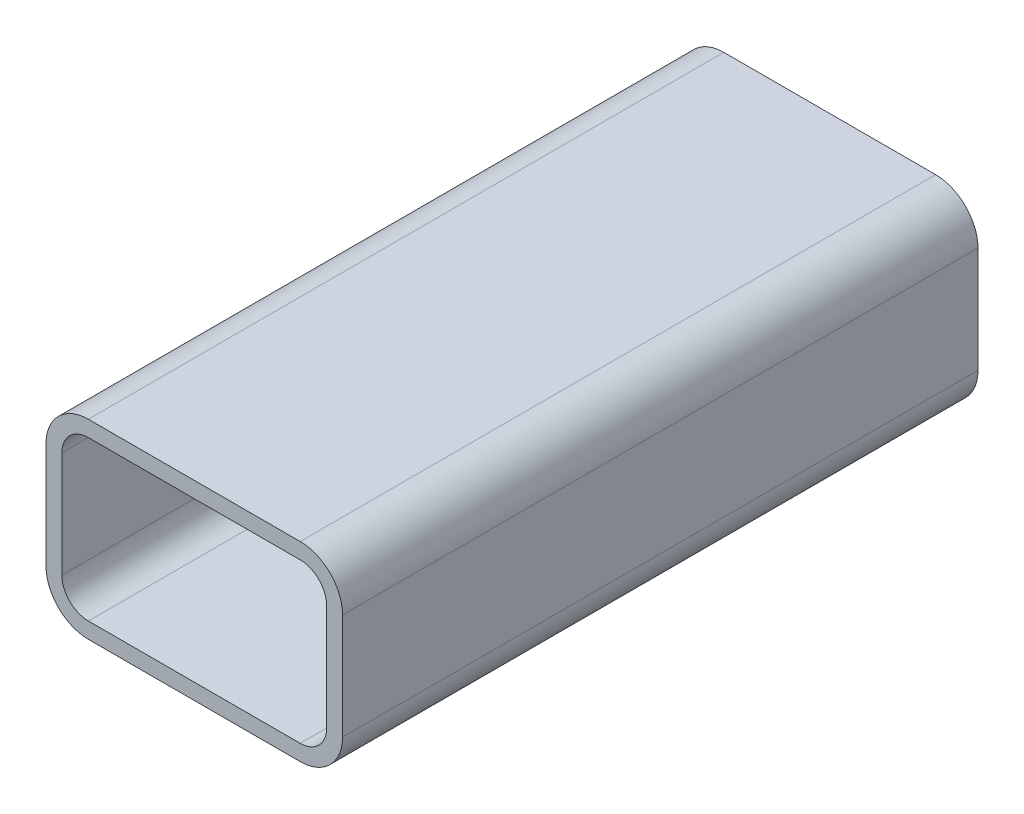
ISO-10303-21;
HEADER;
FILE_DESCRIPTION(('STEP AP214'),'2;1');
FILE_NAME('part.step','',(''),(''),'','','');
FILE_SCHEMA(('AUTOMOTIVE_DESIGN { 1 0 10303 214 1 1 1 1 }'));
ENDSEC;
DATA;
#1=APPLICATION_CONTEXT('core data for automotive mechanical design processes');
#2=APPLICATION_PROTOCOL_DEFINITION('international standard','automotive_design',2000,#1);
#3=PRODUCT_CONTEXT('',#1,'mechanical');
#4=PRODUCT('Part','Part','',(#3));
#5=PRODUCT_RELATED_PRODUCT_CATEGORY('part','',(#4));
#6=PRODUCT_DEFINITION_FORMATION('','',#4);
#7=PRODUCT_DEFINITION_CONTEXT('part definition',#1,'design');
#8=PRODUCT_DEFINITION('design','',#6,#7);
#9=PRODUCT_DEFINITION_SHAPE('','',#8);
#10=(LENGTH_UNIT() NAMED_UNIT(*) SI_UNIT(.MILLI.,.METRE.));
#11=(NAMED_UNIT(*) PLANE_ANGLE_UNIT() SI_UNIT($,.RADIAN.));
#12=(NAMED_UNIT(*) SI_UNIT($,.STERADIAN.) SOLID_ANGLE_UNIT());
#13=UNCERTAINTY_MEASURE_WITH_UNIT(LENGTH_MEASURE(1.E-05),#10,'distance_accuracy_value','');
#14=(GEOMETRIC_REPRESENTATION_CONTEXT(3) GLOBAL_UNCERTAINTY_ASSIGNED_CONTEXT((#13)) GLOBAL_UNIT_ASSIGNED_CONTEXT((#10,
#11,#12)) REPRESENTATION_CONTEXT('',''));
#15=CARTESIAN_POINT('',(0.,0.,0.));
#16=DIRECTION('',(0.,0.,1.));
#17=DIRECTION('',(1.,0.,0.));
#18=AXIS2_PLACEMENT_3D('',#15,#16,#17);
#19=CARTESIAN_POINT('',(-20.,10.,60.));
#20=DIRECTION('',(0.,0.,-1.));
#21=DIRECTION('',(-1.,0.,0.));
#22=AXIS2_PLACEMENT_3D('',#19,#20,#21);
#23=PLANE('',#22);
#24=CARTESIAN_POINT('',(-20.,10.,60.));
#25=DIRECTION('',(0.,0.,-1.));
#26=DIRECTION('',(-1.,0.,0.));
#27=AXIS2_PLACEMENT_3D('',#24,#25,#26);
#28=CIRCLE('',#27,8.);
#29=CARTESIAN_POINT('',(-20.,18.,60.));
#30=VERTEX_POINT('',#29);
#31=CARTESIAN_POINT('',(-28.,10.,60.));
#32=VERTEX_POINT('',#31);
#33=EDGE_CURVE('E290',#30,#32,#28,.F.);
#34=ORIENTED_EDGE('',*,*,#33,.T.);
#35=DIRECTION('',(0.,-1.,0.));
#36=VECTOR('',#35,1.);
#37=CARTESIAN_POINT('',(-28.,10.,60.));
#38=LINE('',#37,#36);
#39=CARTESIAN_POINT('',(-28.,-10.,60.));
#40=VERTEX_POINT('',#39);
#41=EDGE_CURVE('E294',#32,#40,#38,.T.);
#42=ORIENTED_EDGE('',*,*,#41,.T.);
#43=CARTESIAN_POINT('',(-20.,-10.,60.));
#44=DIRECTION('',(0.,0.,-1.));
#45=DIRECTION('',(-1.,0.,0.));
#46=AXIS2_PLACEMENT_3D('',#43,#44,#45);
#47=CIRCLE('',#46,8.);
#48=CARTESIAN_POINT('',(-20.,-18.,60.));
#49=VERTEX_POINT('',#48);
#50=EDGE_CURVE('E298',#40,#49,#47,.F.);
#51=ORIENTED_EDGE('',*,*,#50,.T.);
#52=DIRECTION('',(1.,0.,0.));
#53=VECTOR('',#52,1.);
#54=CARTESIAN_POINT('',(-20.,-18.,60.));
#55=LINE('',#54,#53);
#56=CARTESIAN_POINT('',(20.,-18.,60.));
#57=VERTEX_POINT('',#56);
#58=EDGE_CURVE('E301',#49,#57,#55,.T.);
#59=ORIENTED_EDGE('',*,*,#58,.T.);
#60=CARTESIAN_POINT('',(20.,-10.,60.));
#61=DIRECTION('',(0.,0.,-1.));
#62=DIRECTION('',(-1.,0.,0.));
#63=AXIS2_PLACEMENT_3D('',#60,#61,#62);
#64=CIRCLE('',#63,8.);
#65=CARTESIAN_POINT('',(28.,-10.,60.));
#66=VERTEX_POINT('',#65);
#67=EDGE_CURVE('E304',#57,#66,#64,.F.);
#68=ORIENTED_EDGE('',*,*,#67,.T.);
#69=DIRECTION('',(0.,1.,0.));
#70=VECTOR('',#69,1.);
#71=CARTESIAN_POINT('',(28.,10.,60.));
#72=LINE('',#71,#70);
#73=CARTESIAN_POINT('',(28.,10.,60.));
#74=VERTEX_POINT('',#73);
#75=EDGE_CURVE('E307',#66,#74,#72,.T.);
#76=ORIENTED_EDGE('',*,*,#75,.T.);
#77=CARTESIAN_POINT('',(20.,10.,60.));
#78=DIRECTION('',(0.,0.,-1.));
#79=DIRECTION('',(-1.,0.,0.));
#80=AXIS2_PLACEMENT_3D('',#77,#78,#79);
#81=CIRCLE('',#80,8.);
#82=CARTESIAN_POINT('',(20.,18.,60.));
#83=VERTEX_POINT('',#82);
#84=EDGE_CURVE('E310',#74,#83,#81,.F.);
#85=ORIENTED_EDGE('',*,*,#84,.T.);
#86=DIRECTION('',(-1.,0.,0.));
#87=VECTOR('',#86,1.);
#88=CARTESIAN_POINT('',(-20.,18.,60.));
#89=LINE('',#88,#87);
#90=EDGE_CURVE('E313',#83,#30,#89,.T.);
#91=ORIENTED_EDGE('',*,*,#90,.T.);
#92=EDGE_LOOP('',(#34,#42,#51,#59,#68,#76,#85,#91));
#93=FACE_BOUND('',#92,.T.);
#94=CARTESIAN_POINT('',(-20.,10.,60.));
#95=DIRECTION('',(0.,0.,1.));
#96=DIRECTION('',(-1.,0.,0.));
#97=AXIS2_PLACEMENT_3D('',#94,#95,#96);
#98=CIRCLE('',#97,5.);
#99=CARTESIAN_POINT('',(-20.,15.,60.));
#100=VERTEX_POINT('',#99);
#101=CARTESIAN_POINT('',(-25.,10.,60.));
#102=VERTEX_POINT('',#101);
#103=EDGE_CURVE('E201',#100,#102,#98,.T.);
#104=ORIENTED_EDGE('',*,*,#103,.F.);
#105=DIRECTION('',(-1.,0.,0.));
#106=VECTOR('',#105,1.);
#107=CARTESIAN_POINT('',(-20.,15.,60.));
#108=LINE('',#107,#106);
#109=CARTESIAN_POINT('',(20.,15.,60.));
#110=VERTEX_POINT('',#109);
#111=EDGE_CURVE('E242',#110,#100,#108,.T.);
#112=ORIENTED_EDGE('',*,*,#111,.F.);
#113=CARTESIAN_POINT('',(20.,10.,60.));
#114=DIRECTION('',(0.,0.,1.));
#115=DIRECTION('',(-1.,0.,0.));
#116=AXIS2_PLACEMENT_3D('',#113,#114,#115);
#117=CIRCLE('',#116,5.);
#118=CARTESIAN_POINT('',(25.,10.,60.));
#119=VERTEX_POINT('',#118);
#120=EDGE_CURVE('E239',#119,#110,#117,.T.);
#121=ORIENTED_EDGE('',*,*,#120,.F.);
#122=DIRECTION('',(0.,1.,0.));
#123=VECTOR('',#122,1.);
#124=CARTESIAN_POINT('',(25.,-10.,60.));
#125=LINE('',#124,#123);
#126=CARTESIAN_POINT('',(25.,-10.,60.));
#127=VERTEX_POINT('',#126);
#128=EDGE_CURVE('E236',#127,#119,#125,.T.);
#129=ORIENTED_EDGE('',*,*,#128,.F.);
#130=CARTESIAN_POINT('',(20.,-10.,60.));
#131=DIRECTION('',(0.,0.,1.));
#132=DIRECTION('',(-1.,0.,0.));
#133=AXIS2_PLACEMENT_3D('',#130,#131,#132);
#134=CIRCLE('',#133,5.);
#135=CARTESIAN_POINT('',(20.,-15.,60.));
#136=VERTEX_POINT('',#135);
#137=EDGE_CURVE('E233',#136,#127,#134,.T.);
#138=ORIENTED_EDGE('',*,*,#137,.F.);
#139=DIRECTION('',(1.,0.,0.));
#140=VECTOR('',#139,1.);
#141=CARTESIAN_POINT('',(-20.,-15.,60.));
#142=LINE('',#141,#140);
#143=CARTESIAN_POINT('',(-20.,-15.,60.));
#144=VERTEX_POINT('',#143);
#145=EDGE_CURVE('E228',#144,#136,#142,.T.);
#146=ORIENTED_EDGE('',*,*,#145,.F.);
#147=CARTESIAN_POINT('',(-20.,-10.,60.));
#148=DIRECTION('',(0.,0.,1.));
#149=DIRECTION('',(-1.,0.,0.));
#150=AXIS2_PLACEMENT_3D('',#147,#148,#149);
#151=CIRCLE('',#150,5.);
#152=CARTESIAN_POINT('',(-25.,-10.,60.));
#153=VERTEX_POINT('',#152);
#154=EDGE_CURVE('E224',#153,#144,#151,.T.);
#155=ORIENTED_EDGE('',*,*,#154,.F.);
#156=DIRECTION('',(0.,-1.,0.));
#157=VECTOR('',#156,1.);
#158=CARTESIAN_POINT('',(-25.,-10.,60.));
#159=LINE('',#158,#157);
#160=EDGE_CURVE('E210',#102,#153,#159,.T.);
#161=ORIENTED_EDGE('',*,*,#160,.F.);
#162=EDGE_LOOP('',(#104,#112,#121,#129,#138,#146,#155,#161));
#163=FACE_BOUND('',#162,.T.);
#164=ADVANCED_FACE('F87',(#93,#163),#23,.F.);
#165=CARTESIAN_POINT('',(-20.,10.,-60.));
#166=DIRECTION('',(0.,0.,-1.));
#167=DIRECTION('',(-1.,0.,0.));
#168=AXIS2_PLACEMENT_3D('',#165,#166,#167);
#169=PLANE('',#168);
#170=CARTESIAN_POINT('',(-20.,10.,-60.));
#171=DIRECTION('',(0.,0.,-1.));
#172=DIRECTION('',(-1.,0.,0.));
#173=AXIS2_PLACEMENT_3D('',#170,#171,#172);
#174=CIRCLE('',#173,8.);
#175=CARTESIAN_POINT('',(-20.,18.,-60.));
#176=VERTEX_POINT('',#175);
#177=CARTESIAN_POINT('',(-28.,10.,-60.));
#178=VERTEX_POINT('',#177);
#179=EDGE_CURVE('E219',#176,#178,#174,.F.);
#180=ORIENTED_EDGE('',*,*,#179,.F.);
#181=DIRECTION('',(-1.,0.,0.));
#182=VECTOR('',#181,1.);
#183=CARTESIAN_POINT('',(-20.,18.,-60.));
#184=LINE('',#183,#182);
#185=CARTESIAN_POINT('',(20.,18.,-60.));
#186=VERTEX_POINT('',#185);
#187=EDGE_CURVE('E295',#186,#176,#184,.T.);
#188=ORIENTED_EDGE('',*,*,#187,.F.);
#189=CARTESIAN_POINT('',(20.,10.,-60.));
#190=DIRECTION('',(0.,0.,-1.));
#191=DIRECTION('',(-1.,0.,0.));
#192=AXIS2_PLACEMENT_3D('',#189,#190,#191);
#193=CIRCLE('',#192,8.);
#194=CARTESIAN_POINT('',(28.,10.,-60.));
#195=VERTEX_POINT('',#194);
#196=EDGE_CURVE('E335',#195,#186,#193,.F.);
#197=ORIENTED_EDGE('',*,*,#196,.F.);
#198=DIRECTION('',(0.,1.,0.));
#199=VECTOR('',#198,1.);
#200=CARTESIAN_POINT('',(28.,10.,-60.));
#201=LINE('',#200,#199);
#202=CARTESIAN_POINT('',(28.,-10.,-60.));
#203=VERTEX_POINT('',#202);
#204=EDGE_CURVE('E332',#203,#195,#201,.T.);
#205=ORIENTED_EDGE('',*,*,#204,.F.);
#206=CARTESIAN_POINT('',(20.,-10.,-60.));
#207=DIRECTION('',(0.,0.,-1.));
#208=DIRECTION('',(-1.,0.,0.));
#209=AXIS2_PLACEMENT_3D('',#206,#207,#208);
#210=CIRCLE('',#209,8.);
#211=CARTESIAN_POINT('',(20.,-18.,-60.));
#212=VERTEX_POINT('',#211);
#213=EDGE_CURVE('E329',#212,#203,#210,.F.);
#214=ORIENTED_EDGE('',*,*,#213,.F.);
#215=DIRECTION('',(1.,0.,0.));
#216=VECTOR('',#215,1.);
#217=CARTESIAN_POINT('',(-20.,-18.,-60.));
#218=LINE('',#217,#216);
#219=CARTESIAN_POINT('',(-20.,-18.,-60.));
#220=VERTEX_POINT('',#219);
#221=EDGE_CURVE('E326',#220,#212,#218,.T.);
#222=ORIENTED_EDGE('',*,*,#221,.F.);
#223=CARTESIAN_POINT('',(-20.,-10.,-60.));
#224=DIRECTION('',(0.,0.,-1.));
#225=DIRECTION('',(-1.,0.,0.));
#226=AXIS2_PLACEMENT_3D('',#223,#224,#225);
#227=CIRCLE('',#226,8.);
#228=CARTESIAN_POINT('',(-28.,-10.,-60.));
#229=VERTEX_POINT('',#228);
#230=EDGE_CURVE('E323',#229,#220,#227,.F.);
#231=ORIENTED_EDGE('',*,*,#230,.F.);
#232=DIRECTION('',(0.,-1.,0.));
#233=VECTOR('',#232,1.);
#234=CARTESIAN_POINT('',(-28.,10.,-60.));
#235=LINE('',#234,#233);
#236=EDGE_CURVE('E320',#178,#229,#235,.T.);
#237=ORIENTED_EDGE('',*,*,#236,.F.);
#238=EDGE_LOOP('',(#180,#188,#197,#205,#214,#222,#231,#237));
#239=FACE_BOUND('',#238,.T.);
#240=DIRECTION('',(-1.,0.,0.));
#241=VECTOR('',#240,1.);
#242=CARTESIAN_POINT('',(-20.,15.,-60.));
#243=LINE('',#242,#241);
#244=CARTESIAN_POINT('',(20.,15.,-60.));
#245=VERTEX_POINT('',#244);
#246=CARTESIAN_POINT('',(-20.,15.,-60.));
#247=VERTEX_POINT('',#246);
#248=EDGE_CURVE('E211',#245,#247,#243,.T.);
#249=ORIENTED_EDGE('',*,*,#248,.T.);
#250=CARTESIAN_POINT('',(-20.,10.,-60.));
#251=DIRECTION('',(0.,0.,1.));
#252=DIRECTION('',(-1.,0.,0.));
#253=AXIS2_PLACEMENT_3D('',#250,#251,#252);
#254=CIRCLE('',#253,5.);
#255=CARTESIAN_POINT('',(-25.,10.,-60.));
#256=VERTEX_POINT('',#255);
#257=EDGE_CURVE('E111',#247,#256,#254,.T.);
#258=ORIENTED_EDGE('',*,*,#257,.T.);
#259=DIRECTION('',(0.,-1.,0.));
#260=VECTOR('',#259,1.);
#261=CARTESIAN_POINT('',(-25.,-10.,-60.));
#262=LINE('',#261,#260);
#263=CARTESIAN_POINT('',(-25.,-10.,-60.));
#264=VERTEX_POINT('',#263);
#265=EDGE_CURVE('E217',#256,#264,#262,.T.);
#266=ORIENTED_EDGE('',*,*,#265,.T.);
#267=CARTESIAN_POINT('',(-20.,-10.,-60.));
#268=DIRECTION('',(0.,0.,1.));
#269=DIRECTION('',(-1.,0.,0.));
#270=AXIS2_PLACEMENT_3D('',#267,#268,#269);
#271=CIRCLE('',#270,5.);
#272=CARTESIAN_POINT('',(-20.,-15.,-60.));
#273=VERTEX_POINT('',#272);
#274=EDGE_CURVE('E249',#264,#273,#271,.T.);
#275=ORIENTED_EDGE('',*,*,#274,.T.);
#276=DIRECTION('',(1.,0.,0.));
#277=VECTOR('',#276,1.);
#278=CARTESIAN_POINT('',(-20.,-15.,-60.));
#279=LINE('',#278,#277);
#280=CARTESIAN_POINT('',(20.,-15.,-60.));
#281=VERTEX_POINT('',#280);
#282=EDGE_CURVE('E253',#273,#281,#279,.T.);
#283=ORIENTED_EDGE('',*,*,#282,.T.);
#284=CARTESIAN_POINT('',(20.,-10.,-60.));
#285=DIRECTION('',(0.,0.,1.));
#286=DIRECTION('',(-1.,0.,0.));
#287=AXIS2_PLACEMENT_3D('',#284,#285,#286);
#288=CIRCLE('',#287,5.);
#289=CARTESIAN_POINT('',(25.,-10.,-60.));
#290=VERTEX_POINT('',#289);
#291=EDGE_CURVE('E257',#281,#290,#288,.T.);
#292=ORIENTED_EDGE('',*,*,#291,.T.);
#293=DIRECTION('',(0.,1.,0.));
#294=VECTOR('',#293,1.);
#295=CARTESIAN_POINT('',(25.,-10.,-60.));
#296=LINE('',#295,#294);
#297=CARTESIAN_POINT('',(25.,10.,-60.));
#298=VERTEX_POINT('',#297);
#299=EDGE_CURVE('E261',#290,#298,#296,.T.);
#300=ORIENTED_EDGE('',*,*,#299,.T.);
#301=CARTESIAN_POINT('',(20.,10.,-60.));
#302=DIRECTION('',(0.,0.,1.));
#303=DIRECTION('',(-1.,0.,0.));
#304=AXIS2_PLACEMENT_3D('',#301,#302,#303);
#305=CIRCLE('',#304,5.);
#306=EDGE_CURVE('E265',#298,#245,#305,.T.);
#307=ORIENTED_EDGE('',*,*,#306,.T.);
#308=EDGE_LOOP('',(#249,#258,#266,#275,#283,#292,#300,#307));
#309=FACE_BOUND('',#308,.T.);
#310=ADVANCED_FACE('F374',(#239,#309),#169,.T.);
#311=CARTESIAN_POINT('',(-20.,10.,60.));
#312=DIRECTION('',(0.,0.,-1.));
#313=DIRECTION('',(-1.,0.,0.));
#314=AXIS2_PLACEMENT_3D('',#311,#312,#313);
#315=CYLINDRICAL_SURFACE('',#314,8.);
#316=ORIENTED_EDGE('',*,*,#179,.T.);
#317=DIRECTION('',(0.,0.,-1.));
#318=VECTOR('',#317,1.);
#319=CARTESIAN_POINT('',(-28.,10.,60.));
#320=LINE('',#319,#318);
#321=EDGE_CURVE('E12',#32,#178,#320,.T.);
#322=ORIENTED_EDGE('',*,*,#321,.F.);
#323=ORIENTED_EDGE('',*,*,#33,.F.);
#324=DIRECTION('',(0.,0.,-1.));
#325=VECTOR('',#324,1.);
#326=CARTESIAN_POINT('',(-20.,18.,60.));
#327=LINE('',#326,#325);
#328=EDGE_CURVE('E316',#30,#176,#327,.T.);
#329=ORIENTED_EDGE('',*,*,#328,.T.);
#330=EDGE_LOOP('',(#316,#322,#323,#329));
#331=FACE_BOUND('',#330,.T.);
#332=ADVANCED_FACE('F89',(#331),#315,.T.);
#333=CARTESIAN_POINT('',(-28.,10.,60.));
#334=DIRECTION('',(1.,0.,0.));
#335=DIRECTION('',(0.,0.,-1.));
#336=AXIS2_PLACEMENT_3D('',#333,#334,#335);
#337=PLANE('',#336);
#338=ORIENTED_EDGE('',*,*,#236,.T.);
#339=DIRECTION('',(0.,0.,-1.));
#340=VECTOR('',#339,1.);
#341=CARTESIAN_POINT('',(-28.,-10.,60.));
#342=LINE('',#341,#340);
#343=EDGE_CURVE('E96',#40,#229,#342,.T.);
#344=ORIENTED_EDGE('',*,*,#343,.F.);
#345=ORIENTED_EDGE('',*,*,#41,.F.);
#346=ORIENTED_EDGE('',*,*,#321,.T.);
#347=EDGE_LOOP('',(#338,#344,#345,#346));
#348=FACE_BOUND('',#347,.T.);
#349=ADVANCED_FACE('F391',(#348),#337,.F.);
#350=CARTESIAN_POINT('',(-20.,-10.,60.));
#351=DIRECTION('',(0.,0.,-1.));
#352=DIRECTION('',(-1.,0.,0.));
#353=AXIS2_PLACEMENT_3D('',#350,#351,#352);
#354=CYLINDRICAL_SURFACE('',#353,8.);
#355=ORIENTED_EDGE('',*,*,#230,.T.);
#356=DIRECTION('',(0.,0.,-1.));
#357=VECTOR('',#356,1.);
#358=CARTESIAN_POINT('',(-20.,-18.,60.));
#359=LINE('',#358,#357);
#360=EDGE_CURVE('E359',#49,#220,#359,.T.);
#361=ORIENTED_EDGE('',*,*,#360,.F.);
#362=ORIENTED_EDGE('',*,*,#50,.F.);
#363=ORIENTED_EDGE('',*,*,#343,.T.);
#364=EDGE_LOOP('',(#355,#361,#362,#363));
#365=FACE_BOUND('',#364,.T.);
#366=ADVANCED_FACE('F368',(#365),#354,.T.);
#367=CARTESIAN_POINT('',(-20.,-18.,60.));
#368=DIRECTION('',(0.,1.,0.));
#369=DIRECTION('',(0.,0.,1.));
#370=AXIS2_PLACEMENT_3D('',#367,#368,#369);
#371=PLANE('',#370);
#372=ORIENTED_EDGE('',*,*,#221,.T.);
#373=DIRECTION('',(0.,0.,-1.));
#374=VECTOR('',#373,1.);
#375=CARTESIAN_POINT('',(20.,-18.,60.));
#376=LINE('',#375,#374);
#377=EDGE_CURVE('E355',#57,#212,#376,.T.);
#378=ORIENTED_EDGE('',*,*,#377,.F.);
#379=ORIENTED_EDGE('',*,*,#58,.F.);
#380=ORIENTED_EDGE('',*,*,#360,.T.);
#381=EDGE_LOOP('',(#372,#378,#379,#380));
#382=FACE_BOUND('',#381,.T.);
#383=ADVANCED_FACE('F380',(#382),#371,.F.);
#384=CARTESIAN_POINT('',(20.,-10.,60.));
#385=DIRECTION('',(0.,0.,-1.));
#386=DIRECTION('',(-1.,0.,0.));
#387=AXIS2_PLACEMENT_3D('',#384,#385,#386);
#388=CYLINDRICAL_SURFACE('',#387,8.);
#389=ORIENTED_EDGE('',*,*,#213,.T.);
#390=DIRECTION('',(0.,0.,-1.));
#391=VECTOR('',#390,1.);
#392=CARTESIAN_POINT('',(28.,-10.,60.));
#393=LINE('',#392,#391);
#394=EDGE_CURVE('E351',#66,#203,#393,.T.);
#395=ORIENTED_EDGE('',*,*,#394,.F.);
#396=ORIENTED_EDGE('',*,*,#67,.F.);
#397=ORIENTED_EDGE('',*,*,#377,.T.);
#398=EDGE_LOOP('',(#389,#395,#396,#397));
#399=FACE_BOUND('',#398,.T.);
#400=ADVANCED_FACE('F384',(#399),#388,.T.);
#401=CARTESIAN_POINT('',(28.,10.,60.));
#402=DIRECTION('',(-1.,0.,0.));
#403=DIRECTION('',(0.,0.,1.));
#404=AXIS2_PLACEMENT_3D('',#401,#402,#403);
#405=PLANE('',#404);
#406=ORIENTED_EDGE('',*,*,#204,.T.);
#407=DIRECTION('',(0.,0.,-1.));
#408=VECTOR('',#407,1.);
#409=CARTESIAN_POINT('',(28.,10.,60.));
#410=LINE('',#409,#408);
#411=EDGE_CURVE('E347',#74,#195,#410,.T.);
#412=ORIENTED_EDGE('',*,*,#411,.F.);
#413=ORIENTED_EDGE('',*,*,#75,.F.);
#414=ORIENTED_EDGE('',*,*,#394,.T.);
#415=EDGE_LOOP('',(#406,#412,#413,#414));
#416=FACE_BOUND('',#415,.T.);
#417=ADVANCED_FACE('F404',(#416),#405,.F.);
#418=CARTESIAN_POINT('',(20.,10.,60.));
#419=DIRECTION('',(0.,0.,-1.));
#420=DIRECTION('',(-1.,0.,0.));
#421=AXIS2_PLACEMENT_3D('',#418,#419,#420);
#422=CYLINDRICAL_SURFACE('',#421,8.);
#423=ORIENTED_EDGE('',*,*,#196,.T.);
#424=DIRECTION('',(0.,0.,-1.));
#425=VECTOR('',#424,1.);
#426=CARTESIAN_POINT('',(20.,18.,60.));
#427=LINE('',#426,#425);
#428=EDGE_CURVE('E343',#83,#186,#427,.T.);
#429=ORIENTED_EDGE('',*,*,#428,.F.);
#430=ORIENTED_EDGE('',*,*,#84,.F.);
#431=ORIENTED_EDGE('',*,*,#411,.T.);
#432=EDGE_LOOP('',(#423,#429,#430,#431));
#433=FACE_BOUND('',#432,.T.);
#434=ADVANCED_FACE('F402',(#433),#422,.T.);
#435=CARTESIAN_POINT('',(-20.,18.,60.));
#436=DIRECTION('',(0.,-1.,0.));
#437=DIRECTION('',(0.,0.,-1.));
#438=AXIS2_PLACEMENT_3D('',#435,#436,#437);
#439=PLANE('',#438);
#440=ORIENTED_EDGE('',*,*,#187,.T.);
#441=ORIENTED_EDGE('',*,*,#328,.F.);
#442=ORIENTED_EDGE('',*,*,#90,.F.);
#443=ORIENTED_EDGE('',*,*,#428,.T.);
#444=EDGE_LOOP('',(#440,#441,#442,#443));
#445=FACE_BOUND('',#444,.T.);
#446=ADVANCED_FACE('F397',(#445),#439,.F.);
#447=CARTESIAN_POINT('',(-20.,10.,60.));
#448=DIRECTION('',(0.,0.,-1.));
#449=DIRECTION('',(-1.,0.,0.));
#450=AXIS2_PLACEMENT_3D('',#447,#448,#449);
#451=CYLINDRICAL_SURFACE('',#450,5.);
#452=ORIENTED_EDGE('',*,*,#257,.F.);
#453=DIRECTION('',(0.,0.,-1.));
#454=VECTOR('',#453,1.);
#455=CARTESIAN_POINT('',(-20.,15.,60.));
#456=LINE('',#455,#454);
#457=EDGE_CURVE('E205',#100,#247,#456,.T.);
#458=ORIENTED_EDGE('',*,*,#457,.F.);
#459=ORIENTED_EDGE('',*,*,#103,.T.);
#460=DIRECTION('',(0.,0.,-1.));
#461=VECTOR('',#460,1.);
#462=CARTESIAN_POINT('',(-25.,10.,60.));
#463=LINE('',#462,#461);
#464=EDGE_CURVE('E204',#102,#256,#463,.T.);
#465=ORIENTED_EDGE('',*,*,#464,.T.);
#466=EDGE_LOOP('',(#452,#458,#459,#465));
#467=FACE_BOUND('',#466,.T.);
#468=ADVANCED_FACE('F203',(#467),#451,.F.);
#469=CARTESIAN_POINT('',(-25.,-10.,60.));
#470=DIRECTION('',(1.,0.,0.));
#471=DIRECTION('',(0.,0.,-1.));
#472=AXIS2_PLACEMENT_3D('',#469,#470,#471);
#473=PLANE('',#472);
#474=ORIENTED_EDGE('',*,*,#265,.F.);
#475=ORIENTED_EDGE('',*,*,#464,.F.);
#476=ORIENTED_EDGE('',*,*,#160,.T.);
#477=DIRECTION('',(0.,0.,-1.));
#478=VECTOR('',#477,1.);
#479=CARTESIAN_POINT('',(-25.,-10.,60.));
#480=LINE('',#479,#478);
#481=EDGE_CURVE('E220',#153,#264,#480,.T.);
#482=ORIENTED_EDGE('',*,*,#481,.T.);
#483=EDGE_LOOP('',(#474,#475,#476,#482));
#484=FACE_BOUND('',#483,.T.);
#485=ADVANCED_FACE('F214',(#484),#473,.T.);
#486=CARTESIAN_POINT('',(-20.,-10.,60.));
#487=DIRECTION('',(0.,0.,-1.));
#488=DIRECTION('',(-1.,0.,0.));
#489=AXIS2_PLACEMENT_3D('',#486,#487,#488);
#490=CYLINDRICAL_SURFACE('',#489,5.);
#491=ORIENTED_EDGE('',*,*,#274,.F.);
#492=ORIENTED_EDGE('',*,*,#481,.F.);
#493=ORIENTED_EDGE('',*,*,#154,.T.);
#494=DIRECTION('',(0.,0.,-1.));
#495=VECTOR('',#494,1.);
#496=CARTESIAN_POINT('',(-20.,-15.,60.));
#497=LINE('',#496,#495);
#498=EDGE_CURVE('E285',#144,#273,#497,.T.);
#499=ORIENTED_EDGE('',*,*,#498,.T.);
#500=EDGE_LOOP('',(#491,#492,#493,#499));
#501=FACE_BOUND('',#500,.T.);
#502=ADVANCED_FACE('F429',(#501),#490,.F.);
#503=CARTESIAN_POINT('',(-20.,-15.,60.));
#504=DIRECTION('',(0.,1.,0.));
#505=DIRECTION('',(0.,0.,1.));
#506=AXIS2_PLACEMENT_3D('',#503,#504,#505);
#507=PLANE('',#506);
#508=ORIENTED_EDGE('',*,*,#282,.F.);
#509=ORIENTED_EDGE('',*,*,#498,.F.);
#510=ORIENTED_EDGE('',*,*,#145,.T.);
#511=DIRECTION('',(0.,0.,-1.));
#512=VECTOR('',#511,1.);
#513=CARTESIAN_POINT('',(20.,-15.,60.));
#514=LINE('',#513,#512);
#515=EDGE_CURVE('E282',#136,#281,#514,.T.);
#516=ORIENTED_EDGE('',*,*,#515,.T.);
#517=EDGE_LOOP('',(#508,#509,#510,#516));
#518=FACE_BOUND('',#517,.T.);
#519=ADVANCED_FACE('F433',(#518),#507,.T.);
#520=CARTESIAN_POINT('',(20.,-10.,60.));
#521=DIRECTION('',(0.,0.,-1.));
#522=DIRECTION('',(-1.,0.,0.));
#523=AXIS2_PLACEMENT_3D('',#520,#521,#522);
#524=CYLINDRICAL_SURFACE('',#523,5.);
#525=ORIENTED_EDGE('',*,*,#291,.F.);
#526=ORIENTED_EDGE('',*,*,#515,.F.);
#527=ORIENTED_EDGE('',*,*,#137,.T.);
#528=DIRECTION('',(0.,0.,-1.));
#529=VECTOR('',#528,1.);
#530=CARTESIAN_POINT('',(25.,-10.,60.));
#531=LINE('',#530,#529);
#532=EDGE_CURVE('E279',#127,#290,#531,.T.);
#533=ORIENTED_EDGE('',*,*,#532,.T.);
#534=EDGE_LOOP('',(#525,#526,#527,#533));
#535=FACE_BOUND('',#534,.T.);
#536=ADVANCED_FACE('F439',(#535),#524,.F.);
#537=CARTESIAN_POINT('',(25.,-10.,60.));
#538=DIRECTION('',(-1.,0.,0.));
#539=DIRECTION('',(0.,0.,1.));
#540=AXIS2_PLACEMENT_3D('',#537,#538,#539);
#541=PLANE('',#540);
#542=ORIENTED_EDGE('',*,*,#299,.F.);
#543=ORIENTED_EDGE('',*,*,#532,.F.);
#544=ORIENTED_EDGE('',*,*,#128,.T.);
#545=DIRECTION('',(0.,0.,-1.));
#546=VECTOR('',#545,1.);
#547=CARTESIAN_POINT('',(25.,10.,60.));
#548=LINE('',#547,#546);
#549=EDGE_CURVE('E276',#119,#298,#548,.T.);
#550=ORIENTED_EDGE('',*,*,#549,.T.);
#551=EDGE_LOOP('',(#542,#543,#544,#550));
#552=FACE_BOUND('',#551,.T.);
#553=ADVANCED_FACE('F443',(#552),#541,.T.);
#554=CARTESIAN_POINT('',(20.,10.,60.));
#555=DIRECTION('',(0.,0.,-1.));
#556=DIRECTION('',(-1.,0.,0.));
#557=AXIS2_PLACEMENT_3D('',#554,#555,#556);
#558=CYLINDRICAL_SURFACE('',#557,5.);
#559=ORIENTED_EDGE('',*,*,#306,.F.);
#560=ORIENTED_EDGE('',*,*,#549,.F.);
#561=ORIENTED_EDGE('',*,*,#120,.T.);
#562=DIRECTION('',(0.,0.,-1.));
#563=VECTOR('',#562,1.);
#564=CARTESIAN_POINT('',(20.,15.,60.));
#565=LINE('',#564,#563);
#566=EDGE_CURVE('E103',#110,#245,#565,.T.);
#567=ORIENTED_EDGE('',*,*,#566,.T.);
#568=EDGE_LOOP('',(#559,#560,#561,#567));
#569=FACE_BOUND('',#568,.T.);
#570=ADVANCED_FACE('F447',(#569),#558,.F.);
#571=CARTESIAN_POINT('',(-20.,15.,60.));
#572=DIRECTION('',(0.,-1.,0.));
#573=DIRECTION('',(0.,0.,-1.));
#574=AXIS2_PLACEMENT_3D('',#571,#572,#573);
#575=PLANE('',#574);
#576=ORIENTED_EDGE('',*,*,#248,.F.);
#577=ORIENTED_EDGE('',*,*,#566,.F.);
#578=ORIENTED_EDGE('',*,*,#111,.T.);
#579=ORIENTED_EDGE('',*,*,#457,.T.);
#580=EDGE_LOOP('',(#576,#577,#578,#579));
#581=FACE_BOUND('',#580,.T.);
#582=ADVANCED_FACE('F451',(#581),#575,.T.);
#583=CLOSED_SHELL('',(#164,#310,#332,#349,#366,#383,#400,#417,#434,#446,#468,#485,#502,#519,
#536,#553,#570,#582));
#584=MANIFOLD_SOLID_BREP('B2',#583);
#585=ADVANCED_BREP_SHAPE_REPRESENTATION('',(#18,#584),#14);
#586=SHAPE_DEFINITION_REPRESENTATION(#9,#585);
ENDSEC;
END-ISO-10303-21;
